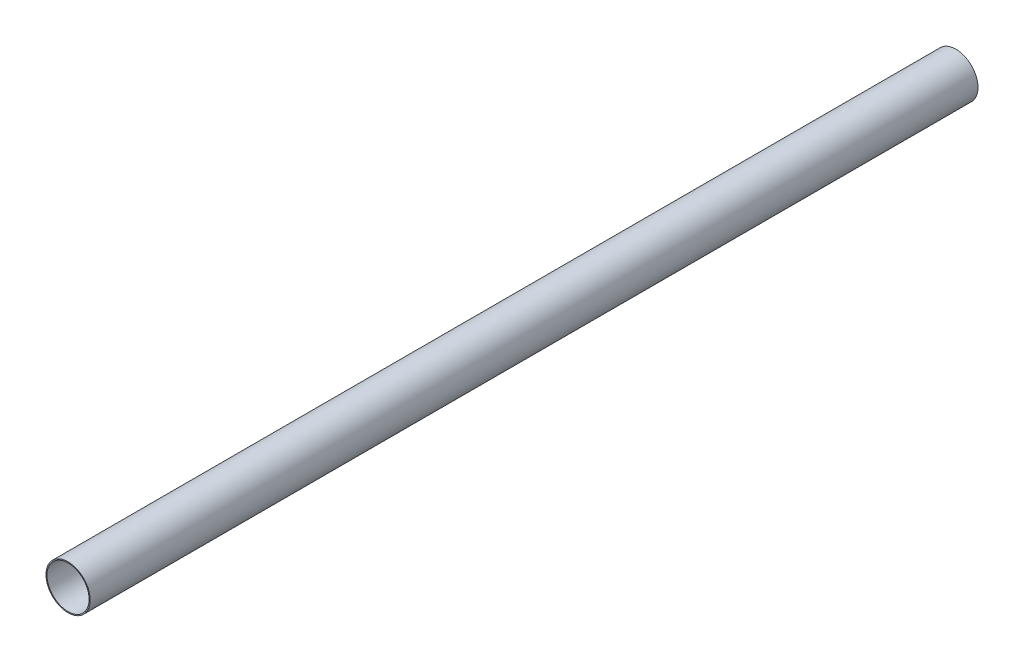
ISO-10303-21;
HEADER;
FILE_DESCRIPTION(('STEP AP214'),'2;1');
FILE_NAME('part.step','',(''),(''),'','','');
FILE_SCHEMA(('AUTOMOTIVE_DESIGN { 1 0 10303 214 1 1 1 1 }'));
ENDSEC;
DATA;
#1=APPLICATION_CONTEXT('core data for automotive mechanical design processes');
#2=APPLICATION_PROTOCOL_DEFINITION('international standard','automotive_design',2000,#1);
#3=PRODUCT_CONTEXT('',#1,'mechanical');
#4=PRODUCT('Part','Part','',(#3));
#5=PRODUCT_RELATED_PRODUCT_CATEGORY('part','',(#4));
#6=PRODUCT_DEFINITION_FORMATION('','',#4);
#7=PRODUCT_DEFINITION_CONTEXT('part definition',#1,'design');
#8=PRODUCT_DEFINITION('design','',#6,#7);
#9=PRODUCT_DEFINITION_SHAPE('','',#8);
#10=(LENGTH_UNIT() NAMED_UNIT(*) SI_UNIT(.MILLI.,.METRE.));
#11=(NAMED_UNIT(*) PLANE_ANGLE_UNIT() SI_UNIT($,.RADIAN.));
#12=(NAMED_UNIT(*) SI_UNIT($,.STERADIAN.) SOLID_ANGLE_UNIT());
#13=UNCERTAINTY_MEASURE_WITH_UNIT(LENGTH_MEASURE(1.E-05),#10,'distance_accuracy_value','');
#14=(GEOMETRIC_REPRESENTATION_CONTEXT(3) GLOBAL_UNCERTAINTY_ASSIGNED_CONTEXT((#13)) GLOBAL_UNIT_ASSIGNED_CONTEXT((#10,
#11,#12)) REPRESENTATION_CONTEXT('',''));
#15=CARTESIAN_POINT('',(0.,0.,0.));
#16=DIRECTION('',(0.,0.,1.));
#17=DIRECTION('',(1.,0.,0.));
#18=AXIS2_PLACEMENT_3D('',#15,#16,#17);
#19=CARTESIAN_POINT('',(0.,0.,5486.4));
#20=DIRECTION('',(0.,0.,1.));
#21=DIRECTION('',(1.,0.,0.));
#22=AXIS2_PLACEMENT_3D('',#19,#20,#21);
#23=PLANE('',#22);
#24=CARTESIAN_POINT('',(0.,0.,5486.4));
#25=DIRECTION('',(0.,0.,1.));
#26=DIRECTION('',(1.,0.,0.));
#27=AXIS2_PLACEMENT_3D('',#24,#25,#26);
#28=CIRCLE('',#27,136.525);
#29=CARTESIAN_POINT('',(136.525,0.,5486.4));
#30=VERTEX_POINT('',#29);
#31=EDGE_CURVE('E10',#30,#30,#28,.T.);
#32=ORIENTED_EDGE('',*,*,#31,.T.);
#33=EDGE_LOOP('',(#32));
#34=FACE_BOUND('',#33,.T.);
#35=CARTESIAN_POINT('',(0.,0.,5486.4));
#36=DIRECTION('',(0.,0.,1.));
#37=DIRECTION('',(1.,0.,0.));
#38=AXIS2_PLACEMENT_3D('',#35,#36,#37);
#39=CIRCLE('',#38,130.175);
#40=CARTESIAN_POINT('',(130.175,0.,5486.4));
#41=VERTEX_POINT('',#40);
#42=EDGE_CURVE('E47',#41,#41,#39,.T.);
#43=ORIENTED_EDGE('',*,*,#42,.F.);
#44=EDGE_LOOP('',(#43));
#45=FACE_BOUND('',#44,.T.);
#46=ADVANCED_FACE('F36',(#34,#45),#23,.T.);
#47=CARTESIAN_POINT('',(0.,0.,0.));
#48=DIRECTION('',(0.,0.,1.));
#49=DIRECTION('',(1.,0.,0.));
#50=AXIS2_PLACEMENT_3D('',#47,#48,#49);
#51=PLANE('',#50);
#52=CARTESIAN_POINT('',(0.,0.,0.));
#53=DIRECTION('',(0.,0.,1.));
#54=DIRECTION('',(1.,0.,0.));
#55=AXIS2_PLACEMENT_3D('',#52,#53,#54);
#56=CIRCLE('',#55,136.525);
#57=CARTESIAN_POINT('',(136.525,0.,0.));
#58=VERTEX_POINT('',#57);
#59=EDGE_CURVE('E40',#58,#58,#56,.T.);
#60=ORIENTED_EDGE('',*,*,#59,.F.);
#61=EDGE_LOOP('',(#60));
#62=FACE_BOUND('',#61,.T.);
#63=CARTESIAN_POINT('',(0.,0.,0.));
#64=DIRECTION('',(0.,0.,1.));
#65=DIRECTION('',(1.,0.,0.));
#66=AXIS2_PLACEMENT_3D('',#63,#64,#65);
#67=CIRCLE('',#66,130.175);
#68=CARTESIAN_POINT('',(130.175,0.,0.));
#69=VERTEX_POINT('',#68);
#70=EDGE_CURVE('E49',#69,#69,#67,.T.);
#71=ORIENTED_EDGE('',*,*,#70,.T.);
#72=EDGE_LOOP('',(#71));
#73=FACE_BOUND('',#72,.T.);
#74=ADVANCED_FACE('F59',(#62,#73),#51,.F.);
#75=CARTESIAN_POINT('',(0.,0.,5486.4));
#76=DIRECTION('',(0.,0.,-1.));
#77=DIRECTION('',(-1.,0.,0.));
#78=AXIS2_PLACEMENT_3D('',#75,#76,#77);
#79=CYLINDRICAL_SURFACE('',#78,136.525);
#80=ORIENTED_EDGE('',*,*,#31,.F.);
#81=EDGE_LOOP('',(#80));
#82=FACE_BOUND('',#81,.T.);
#83=ORIENTED_EDGE('',*,*,#59,.T.);
#84=EDGE_LOOP('',(#83));
#85=FACE_BOUND('',#84,.T.);
#86=ADVANCED_FACE('F38',(#82,#85),#79,.T.);
#87=CARTESIAN_POINT('',(0.,0.,5486.4));
#88=DIRECTION('',(0.,0.,-1.));
#89=DIRECTION('',(-1.,0.,0.));
#90=AXIS2_PLACEMENT_3D('',#87,#88,#89);
#91=CYLINDRICAL_SURFACE('',#90,130.175);
#92=ORIENTED_EDGE('',*,*,#42,.T.);
#93=EDGE_LOOP('',(#92));
#94=FACE_BOUND('',#93,.T.);
#95=ORIENTED_EDGE('',*,*,#70,.F.);
#96=EDGE_LOOP('',(#95));
#97=FACE_BOUND('',#96,.T.);
#98=ADVANCED_FACE('F55',(#94,#97),#91,.F.);
#99=CLOSED_SHELL('',(#46,#74,#86,#98));
#100=MANIFOLD_SOLID_BREP('B2',#99);
#101=ADVANCED_BREP_SHAPE_REPRESENTATION('',(#18,#100),#14);
#102=SHAPE_DEFINITION_REPRESENTATION(#9,#101);
ENDSEC;
END-ISO-10303-21;
